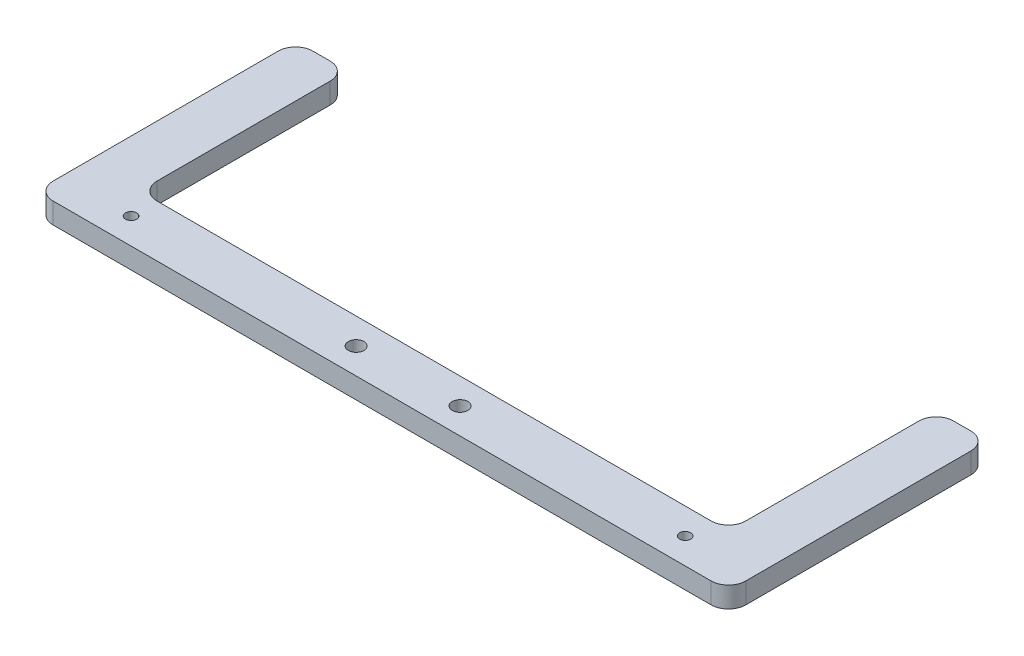
ISO-10303-21;
HEADER;
FILE_DESCRIPTION(('STEP AP214'),'2;1');
FILE_NAME('part.step','',(''),(''),'','','');
FILE_SCHEMA(('AUTOMOTIVE_DESIGN { 1 0 10303 214 1 1 1 1 }'));
ENDSEC;
DATA;
#1=APPLICATION_CONTEXT('core data for automotive mechanical design processes');
#2=APPLICATION_PROTOCOL_DEFINITION('international standard','automotive_design',2000,#1);
#3=PRODUCT_CONTEXT('',#1,'mechanical');
#4=PRODUCT('Part','Part','',(#3));
#5=PRODUCT_RELATED_PRODUCT_CATEGORY('part','',(#4));
#6=PRODUCT_DEFINITION_FORMATION('','',#4);
#7=PRODUCT_DEFINITION_CONTEXT('part definition',#1,'design');
#8=PRODUCT_DEFINITION('design','',#6,#7);
#9=PRODUCT_DEFINITION_SHAPE('','',#8);
#10=(LENGTH_UNIT() NAMED_UNIT(*) SI_UNIT(.MILLI.,.METRE.));
#11=(NAMED_UNIT(*) PLANE_ANGLE_UNIT() SI_UNIT($,.RADIAN.));
#12=(NAMED_UNIT(*) SI_UNIT($,.STERADIAN.) SOLID_ANGLE_UNIT());
#13=UNCERTAINTY_MEASURE_WITH_UNIT(LENGTH_MEASURE(1.E-05),#10,'distance_accuracy_value','');
#14=(GEOMETRIC_REPRESENTATION_CONTEXT(3) GLOBAL_UNCERTAINTY_ASSIGNED_CONTEXT((#13)) GLOBAL_UNIT_ASSIGNED_CONTEXT((#10,
#11,#12)) REPRESENTATION_CONTEXT('',''));
#15=CARTESIAN_POINT('',(0.,0.,0.));
#16=DIRECTION('',(0.,0.,1.));
#17=DIRECTION('',(1.,0.,0.));
#18=AXIS2_PLACEMENT_3D('',#15,#16,#17);
#19=CARTESIAN_POINT('',(0.,6.,0.));
#20=DIRECTION('',(0.,0.,1.));
#21=DIRECTION('',(1.,0.,0.));
#22=AXIS2_PLACEMENT_3D('',#19,#20,#21);
#23=PLANE('',#22);
#24=DIRECTION('',(-1.,0.,0.));
#25=VECTOR('',#24,1.);
#26=CARTESIAN_POINT('',(0.,6.,0.));
#27=LINE('',#26,#25);
#28=CARTESIAN_POINT('',(80.,6.,0.));
#29=VERTEX_POINT('',#28);
#30=CARTESIAN_POINT('',(-80.,6.,0.));
#31=VERTEX_POINT('',#30);
#32=EDGE_CURVE('E190',#29,#31,#27,.T.);
#33=ORIENTED_EDGE('',*,*,#32,.F.);
#34=DIRECTION('',(0.,-1.,0.));
#35=VECTOR('',#34,1.);
#36=CARTESIAN_POINT('',(80.,6.,0.));
#37=LINE('',#36,#35);
#38=CARTESIAN_POINT('',(80.,0.,0.));
#39=VERTEX_POINT('',#38);
#40=EDGE_CURVE('E218',#29,#39,#37,.T.);
#41=ORIENTED_EDGE('',*,*,#40,.T.);
#42=DIRECTION('',(-1.,0.,0.));
#43=VECTOR('',#42,1.);
#44=CARTESIAN_POINT('',(0.,0.,0.));
#45=LINE('',#44,#43);
#46=CARTESIAN_POINT('',(-80.,0.,0.));
#47=VERTEX_POINT('',#46);
#48=EDGE_CURVE('E176',#39,#47,#45,.T.);
#49=ORIENTED_EDGE('',*,*,#48,.T.);
#50=DIRECTION('',(0.,-1.,0.));
#51=VECTOR('',#50,1.);
#52=CARTESIAN_POINT('',(-80.,6.,0.));
#53=LINE('',#52,#51);
#54=EDGE_CURVE('E154',#47,#31,#53,.F.);
#55=ORIENTED_EDGE('',*,*,#54,.T.);
#56=EDGE_LOOP('',(#33,#41,#49,#55));
#57=FACE_BOUND('',#56,.T.);
#58=ADVANCED_FACE('F33',(#57),#23,.F.);
#59=CARTESIAN_POINT('',(-85.,6.,0.));
#60=DIRECTION('',(-1.,0.,0.));
#61=DIRECTION('',(0.,0.,1.));
#62=AXIS2_PLACEMENT_3D('',#59,#60,#61);
#63=PLANE('',#62);
#64=DIRECTION('',(0.,0.,-1.));
#65=VECTOR('',#64,1.);
#66=CARTESIAN_POINT('',(-85.,6.,0.));
#67=LINE('',#66,#65);
#68=CARTESIAN_POINT('',(-85.,6.,-4.99999999999999));
#69=VERTEX_POINT('',#68);
#70=CARTESIAN_POINT('',(-85.,6.,-55.));
#71=VERTEX_POINT('',#70);
#72=EDGE_CURVE('E168',#69,#71,#67,.T.);
#73=ORIENTED_EDGE('',*,*,#72,.F.);
#74=DIRECTION('',(0.,-1.,0.));
#75=VECTOR('',#74,1.);
#76=CARTESIAN_POINT('',(-85.,0.,-4.99999999999999));
#77=LINE('',#76,#75);
#78=CARTESIAN_POINT('',(-85.,0.,-4.99999999999999));
#79=VERTEX_POINT('',#78);
#80=EDGE_CURVE('E152',#69,#79,#77,.T.);
#81=ORIENTED_EDGE('',*,*,#80,.T.);
#82=DIRECTION('',(0.,0.,-1.));
#83=VECTOR('',#82,1.);
#84=CARTESIAN_POINT('',(-85.,0.,0.));
#85=LINE('',#84,#83);
#86=CARTESIAN_POINT('',(-85.,0.,-55.));
#87=VERTEX_POINT('',#86);
#88=EDGE_CURVE('E165',#79,#87,#85,.T.);
#89=ORIENTED_EDGE('',*,*,#88,.T.);
#90=DIRECTION('',(0.,-1.,0.));
#91=VECTOR('',#90,1.);
#92=CARTESIAN_POINT('',(-85.,6.,-55.));
#93=LINE('',#92,#91);
#94=EDGE_CURVE('E169',#87,#71,#93,.F.);
#95=ORIENTED_EDGE('',*,*,#94,.T.);
#96=EDGE_LOOP('',(#73,#81,#89,#95));
#97=FACE_BOUND('',#96,.T.);
#98=ADVANCED_FACE('F164',(#97),#63,.F.);
#99=CARTESIAN_POINT('',(-85.,6.,-60.));
#100=DIRECTION('',(0.,0.,1.));
#101=DIRECTION('',(1.,0.,0.));
#102=AXIS2_PLACEMENT_3D('',#99,#100,#101);
#103=PLANE('',#102);
#104=DIRECTION('',(-1.,0.,0.));
#105=VECTOR('',#104,1.);
#106=CARTESIAN_POINT('',(-85.,0.,-60.));
#107=LINE('',#106,#105);
#108=CARTESIAN_POINT('',(-90.,0.,-60.));
#109=VERTEX_POINT('',#108);
#110=CARTESIAN_POINT('',(-95.,0.,-60.));
#111=VERTEX_POINT('',#110);
#112=EDGE_CURVE('E175',#109,#111,#107,.T.);
#113=ORIENTED_EDGE('',*,*,#112,.T.);
#114=DIRECTION('',(0.,-1.,0.));
#115=VECTOR('',#114,1.);
#116=CARTESIAN_POINT('',(-95.,6.,-60.));
#117=LINE('',#116,#115);
#118=CARTESIAN_POINT('',(-95.,6.,-60.));
#119=VERTEX_POINT('',#118);
#120=EDGE_CURVE('E159',#111,#119,#117,.F.);
#121=ORIENTED_EDGE('',*,*,#120,.T.);
#122=DIRECTION('',(-1.,0.,0.));
#123=VECTOR('',#122,1.);
#124=CARTESIAN_POINT('',(-85.,6.,-60.));
#125=LINE('',#124,#123);
#126=CARTESIAN_POINT('',(-90.,6.,-60.));
#127=VERTEX_POINT('',#126);
#128=EDGE_CURVE('E269',#127,#119,#125,.T.);
#129=ORIENTED_EDGE('',*,*,#128,.F.);
#130=DIRECTION('',(0.,-1.,0.));
#131=VECTOR('',#130,1.);
#132=CARTESIAN_POINT('',(-90.,6.,-60.));
#133=LINE('',#132,#131);
#134=EDGE_CURVE('E213',#127,#109,#133,.T.);
#135=ORIENTED_EDGE('',*,*,#134,.T.);
#136=EDGE_LOOP('',(#113,#121,#129,#135));
#137=FACE_BOUND('',#136,.T.);
#138=ADVANCED_FACE('F346',(#137),#103,.F.);
#139=CARTESIAN_POINT('',(-100.,6.,-60.));
#140=DIRECTION('',(1.,0.,0.));
#141=DIRECTION('',(0.,0.,-1.));
#142=AXIS2_PLACEMENT_3D('',#139,#140,#141);
#143=PLANE('',#142);
#144=DIRECTION('',(0.,0.,1.));
#145=VECTOR('',#144,1.);
#146=CARTESIAN_POINT('',(-100.,0.,-60.));
#147=LINE('',#146,#145);
#148=CARTESIAN_POINT('',(-100.,0.,-55.));
#149=VERTEX_POINT('',#148);
#150=CARTESIAN_POINT('',(-100.,0.,10.));
#151=VERTEX_POINT('',#150);
#152=EDGE_CURVE('E179',#149,#151,#147,.T.);
#153=ORIENTED_EDGE('',*,*,#152,.T.);
#154=DIRECTION('',(0.,-1.,0.));
#155=VECTOR('',#154,1.);
#156=CARTESIAN_POINT('',(-100.,6.,10.));
#157=LINE('',#156,#155);
#158=CARTESIAN_POINT('',(-100.,6.,10.));
#159=VERTEX_POINT('',#158);
#160=EDGE_CURVE('E205',#151,#159,#157,.F.);
#161=ORIENTED_EDGE('',*,*,#160,.T.);
#162=DIRECTION('',(0.,0.,1.));
#163=VECTOR('',#162,1.);
#164=CARTESIAN_POINT('',(-100.,6.,-60.));
#165=LINE('',#164,#163);
#166=CARTESIAN_POINT('',(-100.,6.,-55.));
#167=VERTEX_POINT('',#166);
#168=EDGE_CURVE('E277',#167,#159,#165,.T.);
#169=ORIENTED_EDGE('',*,*,#168,.F.);
#170=DIRECTION('',(0.,-1.,0.));
#171=VECTOR('',#170,1.);
#172=CARTESIAN_POINT('',(-100.,6.,-55.));
#173=LINE('',#172,#171);
#174=EDGE_CURVE('E202',#167,#149,#173,.T.);
#175=ORIENTED_EDGE('',*,*,#174,.T.);
#176=EDGE_LOOP('',(#153,#161,#169,#175));
#177=FACE_BOUND('',#176,.T.);
#178=ADVANCED_FACE('F401',(#177),#143,.F.);
#179=CARTESIAN_POINT('',(-100.,6.,15.));
#180=DIRECTION('',(0.,0.,-1.));
#181=DIRECTION('',(-1.,0.,0.));
#182=AXIS2_PLACEMENT_3D('',#179,#180,#181);
#183=PLANE('',#182);
#184=DIRECTION('',(1.,0.,0.));
#185=VECTOR('',#184,1.);
#186=CARTESIAN_POINT('',(-100.,0.,15.));
#187=LINE('',#186,#185);
#188=CARTESIAN_POINT('',(-95.,0.,15.));
#189=VERTEX_POINT('',#188);
#190=CARTESIAN_POINT('',(95.,0.,15.));
#191=VERTEX_POINT('',#190);
#192=EDGE_CURVE('E187',#189,#191,#187,.T.);
#193=ORIENTED_EDGE('',*,*,#192,.T.);
#194=DIRECTION('',(0.,-1.,0.));
#195=VECTOR('',#194,1.);
#196=CARTESIAN_POINT('',(95.,6.,15.));
#197=LINE('',#196,#195);
#198=CARTESIAN_POINT('',(95.,6.,15.));
#199=VERTEX_POINT('',#198);
#200=EDGE_CURVE('E237',#191,#199,#197,.F.);
#201=ORIENTED_EDGE('',*,*,#200,.T.);
#202=DIRECTION('',(1.,0.,0.));
#203=VECTOR('',#202,1.);
#204=CARTESIAN_POINT('',(-100.,6.,15.));
#205=LINE('',#204,#203);
#206=CARTESIAN_POINT('',(-95.,6.,15.));
#207=VERTEX_POINT('',#206);
#208=EDGE_CURVE('E191',#207,#199,#205,.T.);
#209=ORIENTED_EDGE('',*,*,#208,.F.);
#210=DIRECTION('',(0.,-1.,0.));
#211=VECTOR('',#210,1.);
#212=CARTESIAN_POINT('',(-95.,6.,15.));
#213=LINE('',#212,#211);
#214=EDGE_CURVE('E194',#207,#189,#213,.T.);
#215=ORIENTED_EDGE('',*,*,#214,.T.);
#216=EDGE_LOOP('',(#193,#201,#209,#215));
#217=FACE_BOUND('',#216,.T.);
#218=ADVANCED_FACE('F395',(#217),#183,.F.);
#219=CARTESIAN_POINT('',(0.,6.,0.));
#220=DIRECTION('',(0.,1.,0.));
#221=DIRECTION('',(0.,0.,1.));
#222=AXIS2_PLACEMENT_3D('',#219,#220,#221);
#223=PLANE('',#222);
#224=CARTESIAN_POINT('',(15.,6.,7.5));
#225=DIRECTION('',(0.,-1.,0.));
#226=DIRECTION('',(0.,0.,1.));
#227=AXIS2_PLACEMENT_3D('',#224,#225,#226);
#228=CIRCLE('',#227,2.25);
#229=CARTESIAN_POINT('',(15.,6.,9.74999999999999));
#230=VERTEX_POINT('',#229);
#231=EDGE_CURVE('E300',#230,#230,#228,.T.);
#232=ORIENTED_EDGE('',*,*,#231,.T.);
#233=EDGE_LOOP('',(#232));
#234=FACE_BOUND('',#233,.T.);
#235=CARTESIAN_POINT('',(80.,6.,7.5));
#236=DIRECTION('',(0.,-1.,0.));
#237=DIRECTION('',(0.,0.,1.));
#238=AXIS2_PLACEMENT_3D('',#235,#236,#237);
#239=CIRCLE('',#238,1.60000000000001);
#240=CARTESIAN_POINT('',(80.,6.,9.1));
#241=VERTEX_POINT('',#240);
#242=EDGE_CURVE('E320',#241,#241,#239,.T.);
#243=ORIENTED_EDGE('',*,*,#242,.T.);
#244=EDGE_LOOP('',(#243));
#245=FACE_BOUND('',#244,.T.);
#246=CARTESIAN_POINT('',(-15.,6.,7.5));
#247=DIRECTION('',(0.,1.,0.));
#248=DIRECTION('',(0.,0.,1.));
#249=AXIS2_PLACEMENT_3D('',#246,#247,#248);
#250=CIRCLE('',#249,2.25);
#251=CARTESIAN_POINT('',(-15.,6.,9.74999999999999));
#252=VERTEX_POINT('',#251);
#253=EDGE_CURVE('E307',#252,#252,#250,.T.);
#254=ORIENTED_EDGE('',*,*,#253,.F.);
#255=EDGE_LOOP('',(#254));
#256=FACE_BOUND('',#255,.T.);
#257=CARTESIAN_POINT('',(-80.,6.,7.5));
#258=DIRECTION('',(0.,1.,0.));
#259=DIRECTION('',(0.,0.,1.));
#260=AXIS2_PLACEMENT_3D('',#257,#258,#259);
#261=CIRCLE('',#260,1.60000000000001);
#262=CARTESIAN_POINT('',(-80.,6.,9.1));
#263=VERTEX_POINT('',#262);
#264=EDGE_CURVE('E272',#263,#263,#261,.T.);
#265=ORIENTED_EDGE('',*,*,#264,.F.);
#266=EDGE_LOOP('',(#265));
#267=FACE_BOUND('',#266,.T.);
#268=ORIENTED_EDGE('',*,*,#208,.T.);
#269=CARTESIAN_POINT('',(95.,6.,10.));
#270=DIRECTION('',(0.,1.,0.));
#271=DIRECTION('',(0.,0.,1.));
#272=AXIS2_PLACEMENT_3D('',#269,#270,#271);
#273=CIRCLE('',#272,5.);
#274=CARTESIAN_POINT('',(100.,6.,10.));
#275=VERTEX_POINT('',#274);
#276=EDGE_CURVE('E242',#199,#275,#273,.T.);
#277=ORIENTED_EDGE('',*,*,#276,.T.);
#278=DIRECTION('',(0.,0.,1.));
#279=VECTOR('',#278,1.);
#280=CARTESIAN_POINT('',(100.,6.,-60.));
#281=LINE('',#280,#279);
#282=CARTESIAN_POINT('',(100.,6.,-55.));
#283=VERTEX_POINT('',#282);
#284=EDGE_CURVE('E258',#283,#275,#281,.T.);
#285=ORIENTED_EDGE('',*,*,#284,.F.);
#286=CARTESIAN_POINT('',(95.,6.,-55.));
#287=DIRECTION('',(0.,1.,0.));
#288=DIRECTION('',(0.,0.,1.));
#289=AXIS2_PLACEMENT_3D('',#286,#287,#288);
#290=CIRCLE('',#289,5.);
#291=CARTESIAN_POINT('',(95.,6.,-60.));
#292=VERTEX_POINT('',#291);
#293=EDGE_CURVE('E48',#283,#292,#290,.T.);
#294=ORIENTED_EDGE('',*,*,#293,.T.);
#295=DIRECTION('',(1.,0.,0.));
#296=VECTOR('',#295,1.);
#297=CARTESIAN_POINT('',(85.,6.,-60.));
#298=LINE('',#297,#296);
#299=CARTESIAN_POINT('',(90.,6.,-60.));
#300=VERTEX_POINT('',#299);
#301=EDGE_CURVE('E316',#300,#292,#298,.T.);
#302=ORIENTED_EDGE('',*,*,#301,.F.);
#303=CARTESIAN_POINT('',(90.,6.,-55.));
#304=DIRECTION('',(0.,1.,0.));
#305=DIRECTION('',(0.,0.,1.));
#306=AXIS2_PLACEMENT_3D('',#303,#304,#305);
#307=CIRCLE('',#306,5.);
#308=CARTESIAN_POINT('',(85.,6.,-55.));
#309=VERTEX_POINT('',#308);
#310=EDGE_CURVE('E239',#300,#309,#307,.T.);
#311=ORIENTED_EDGE('',*,*,#310,.T.);
#312=DIRECTION('',(0.,0.,-1.));
#313=VECTOR('',#312,1.);
#314=CARTESIAN_POINT('',(85.,6.,0.));
#315=LINE('',#314,#313);
#316=CARTESIAN_POINT('',(85.,6.,-5.00000000000001));
#317=VERTEX_POINT('',#316);
#318=EDGE_CURVE('E266',#317,#309,#315,.T.);
#319=ORIENTED_EDGE('',*,*,#318,.F.);
#320=CARTESIAN_POINT('',(80.,6.,-5.00000000000001));
#321=DIRECTION('',(0.,1.,0.));
#322=DIRECTION('',(0.,0.,1.));
#323=AXIS2_PLACEMENT_3D('',#320,#321,#322);
#324=CIRCLE('',#323,5.);
#325=EDGE_CURVE('E11',#317,#29,#324,.F.);
#326=ORIENTED_EDGE('',*,*,#325,.T.);
#327=ORIENTED_EDGE('',*,*,#32,.T.);
#328=CARTESIAN_POINT('',(-80.,6.,-4.99999999999999));
#329=DIRECTION('',(0.,1.,0.));
#330=DIRECTION('',(0.,0.,1.));
#331=AXIS2_PLACEMENT_3D('',#328,#329,#330);
#332=CIRCLE('',#331,5.);
#333=EDGE_CURVE('E158',#31,#69,#332,.F.);
#334=ORIENTED_EDGE('',*,*,#333,.T.);
#335=ORIENTED_EDGE('',*,*,#72,.T.);
#336=CARTESIAN_POINT('',(-90.,6.,-55.));
#337=DIRECTION('',(0.,1.,0.));
#338=DIRECTION('',(0.,0.,1.));
#339=AXIS2_PLACEMENT_3D('',#336,#337,#338);
#340=CIRCLE('',#339,5.);
#341=EDGE_CURVE('E207',#71,#127,#340,.T.);
#342=ORIENTED_EDGE('',*,*,#341,.T.);
#343=ORIENTED_EDGE('',*,*,#128,.T.);
#344=CARTESIAN_POINT('',(-95.,6.,-55.));
#345=DIRECTION('',(0.,1.,0.));
#346=DIRECTION('',(0.,0.,1.));
#347=AXIS2_PLACEMENT_3D('',#344,#345,#346);
#348=CIRCLE('',#347,5.);
#349=EDGE_CURVE('E209',#119,#167,#348,.T.);
#350=ORIENTED_EDGE('',*,*,#349,.T.);
#351=ORIENTED_EDGE('',*,*,#168,.T.);
#352=CARTESIAN_POINT('',(-95.,6.,10.));
#353=DIRECTION('',(0.,1.,0.));
#354=DIRECTION('',(0.,0.,1.));
#355=AXIS2_PLACEMENT_3D('',#352,#353,#354);
#356=CIRCLE('',#355,5.);
#357=EDGE_CURVE('E211',#159,#207,#356,.T.);
#358=ORIENTED_EDGE('',*,*,#357,.T.);
#359=EDGE_LOOP('',(#268,#277,#285,#294,#302,#311,#319,#326,#327,#334,#335,#342,#343,#350,#351,#358));
#360=FACE_BOUND('',#359,.T.);
#361=ADVANCED_FACE('F265',(#234,#245,#256,#267,#360),#223,.T.);
#362=CARTESIAN_POINT('',(0.,0.,0.));
#363=DIRECTION('',(0.,1.,0.));
#364=DIRECTION('',(0.,0.,1.));
#365=AXIS2_PLACEMENT_3D('',#362,#363,#364);
#366=PLANE('',#365);
#367=CARTESIAN_POINT('',(15.,0.,7.5));
#368=DIRECTION('',(0.,-1.,0.));
#369=DIRECTION('',(0.,0.,1.));
#370=AXIS2_PLACEMENT_3D('',#367,#368,#369);
#371=CIRCLE('',#370,2.25);
#372=CARTESIAN_POINT('',(15.,0.,9.74999999999999));
#373=VERTEX_POINT('',#372);
#374=EDGE_CURVE('E296',#373,#373,#371,.T.);
#375=ORIENTED_EDGE('',*,*,#374,.F.);
#376=EDGE_LOOP('',(#375));
#377=FACE_BOUND('',#376,.T.);
#378=CARTESIAN_POINT('',(80.,0.,7.5));
#379=DIRECTION('',(0.,-1.,0.));
#380=DIRECTION('',(0.,0.,1.));
#381=AXIS2_PLACEMENT_3D('',#378,#379,#380);
#382=CIRCLE('',#381,1.60000000000001);
#383=CARTESIAN_POINT('',(80.,0.,9.1));
#384=VERTEX_POINT('',#383);
#385=EDGE_CURVE('E323',#384,#384,#382,.T.);
#386=ORIENTED_EDGE('',*,*,#385,.F.);
#387=EDGE_LOOP('',(#386));
#388=FACE_BOUND('',#387,.T.);
#389=CARTESIAN_POINT('',(-15.,0.,7.5));
#390=DIRECTION('',(0.,1.,0.));
#391=DIRECTION('',(0.,0.,1.));
#392=AXIS2_PLACEMENT_3D('',#389,#390,#391);
#393=CIRCLE('',#392,2.25);
#394=CARTESIAN_POINT('',(-15.,0.,9.74999999999999));
#395=VERTEX_POINT('',#394);
#396=EDGE_CURVE('E181',#395,#395,#393,.T.);
#397=ORIENTED_EDGE('',*,*,#396,.T.);
#398=EDGE_LOOP('',(#397));
#399=FACE_BOUND('',#398,.T.);
#400=CARTESIAN_POINT('',(-80.,0.,7.5));
#401=DIRECTION('',(0.,1.,0.));
#402=DIRECTION('',(0.,0.,1.));
#403=AXIS2_PLACEMENT_3D('',#400,#401,#402);
#404=CIRCLE('',#403,1.60000000000001);
#405=CARTESIAN_POINT('',(-80.,0.,9.1));
#406=VERTEX_POINT('',#405);
#407=EDGE_CURVE('E309',#406,#406,#404,.T.);
#408=ORIENTED_EDGE('',*,*,#407,.T.);
#409=EDGE_LOOP('',(#408));
#410=FACE_BOUND('',#409,.T.);
#411=DIRECTION('',(0.,0.,1.));
#412=VECTOR('',#411,1.);
#413=CARTESIAN_POINT('',(100.,0.,-60.));
#414=LINE('',#413,#412);
#415=CARTESIAN_POINT('',(100.,0.,-55.));
#416=VERTEX_POINT('',#415);
#417=CARTESIAN_POINT('',(100.,0.,10.));
#418=VERTEX_POINT('',#417);
#419=EDGE_CURVE('E292',#416,#418,#414,.T.);
#420=ORIENTED_EDGE('',*,*,#419,.T.);
#421=CARTESIAN_POINT('',(95.,0.,10.));
#422=DIRECTION('',(0.,1.,0.));
#423=DIRECTION('',(0.,0.,1.));
#424=AXIS2_PLACEMENT_3D('',#421,#422,#423);
#425=CIRCLE('',#424,5.);
#426=EDGE_CURVE('E235',#418,#191,#425,.F.);
#427=ORIENTED_EDGE('',*,*,#426,.T.);
#428=ORIENTED_EDGE('',*,*,#192,.F.);
#429=CARTESIAN_POINT('',(-95.,0.,10.));
#430=DIRECTION('',(0.,1.,0.));
#431=DIRECTION('',(0.,0.,1.));
#432=AXIS2_PLACEMENT_3D('',#429,#430,#431);
#433=CIRCLE('',#432,5.);
#434=EDGE_CURVE('E200',#189,#151,#433,.F.);
#435=ORIENTED_EDGE('',*,*,#434,.T.);
#436=ORIENTED_EDGE('',*,*,#152,.F.);
#437=CARTESIAN_POINT('',(-95.,0.,-55.));
#438=DIRECTION('',(0.,1.,0.));
#439=DIRECTION('',(0.,0.,1.));
#440=AXIS2_PLACEMENT_3D('',#437,#438,#439);
#441=CIRCLE('',#440,5.);
#442=EDGE_CURVE('E198',#149,#111,#441,.F.);
#443=ORIENTED_EDGE('',*,*,#442,.T.);
#444=ORIENTED_EDGE('',*,*,#112,.F.);
#445=CARTESIAN_POINT('',(-90.,0.,-55.));
#446=DIRECTION('',(0.,1.,0.));
#447=DIRECTION('',(0.,0.,1.));
#448=AXIS2_PLACEMENT_3D('',#445,#446,#447);
#449=CIRCLE('',#448,5.);
#450=EDGE_CURVE('E174',#109,#87,#449,.F.);
#451=ORIENTED_EDGE('',*,*,#450,.T.);
#452=ORIENTED_EDGE('',*,*,#88,.F.);
#453=CARTESIAN_POINT('',(-80.,0.,-4.99999999999999));
#454=DIRECTION('',(0.,1.,0.));
#455=DIRECTION('',(0.,0.,1.));
#456=AXIS2_PLACEMENT_3D('',#453,#454,#455);
#457=CIRCLE('',#456,5.);
#458=EDGE_CURVE('E148',#79,#47,#457,.T.);
#459=ORIENTED_EDGE('',*,*,#458,.T.);
#460=ORIENTED_EDGE('',*,*,#48,.F.);
#461=CARTESIAN_POINT('',(80.,0.,-5.00000000000001));
#462=DIRECTION('',(0.,1.,0.));
#463=DIRECTION('',(0.,0.,1.));
#464=AXIS2_PLACEMENT_3D('',#461,#462,#463);
#465=CIRCLE('',#464,5.);
#466=CARTESIAN_POINT('',(85.,0.,-5.00000000000001));
#467=VERTEX_POINT('',#466);
#468=EDGE_CURVE('E41',#39,#467,#465,.T.);
#469=ORIENTED_EDGE('',*,*,#468,.T.);
#470=DIRECTION('',(0.,0.,-1.));
#471=VECTOR('',#470,1.);
#472=CARTESIAN_POINT('',(85.,0.,0.));
#473=LINE('',#472,#471);
#474=CARTESIAN_POINT('',(85.,0.,-55.));
#475=VERTEX_POINT('',#474);
#476=EDGE_CURVE('E249',#467,#475,#473,.T.);
#477=ORIENTED_EDGE('',*,*,#476,.T.);
#478=CARTESIAN_POINT('',(90.,0.,-55.));
#479=DIRECTION('',(0.,1.,0.));
#480=DIRECTION('',(0.,0.,1.));
#481=AXIS2_PLACEMENT_3D('',#478,#479,#480);
#482=CIRCLE('',#481,5.);
#483=CARTESIAN_POINT('',(90.,0.,-60.));
#484=VERTEX_POINT('',#483);
#485=EDGE_CURVE('E231',#475,#484,#482,.F.);
#486=ORIENTED_EDGE('',*,*,#485,.T.);
#487=DIRECTION('',(1.,0.,0.));
#488=VECTOR('',#487,1.);
#489=CARTESIAN_POINT('',(85.,0.,-60.));
#490=LINE('',#489,#488);
#491=CARTESIAN_POINT('',(95.,0.,-60.));
#492=VERTEX_POINT('',#491);
#493=EDGE_CURVE('E259',#484,#492,#490,.T.);
#494=ORIENTED_EDGE('',*,*,#493,.T.);
#495=CARTESIAN_POINT('',(95.,0.,-55.));
#496=DIRECTION('',(0.,1.,0.));
#497=DIRECTION('',(0.,0.,1.));
#498=AXIS2_PLACEMENT_3D('',#495,#496,#497);
#499=CIRCLE('',#498,5.);
#500=EDGE_CURVE('E233',#492,#416,#499,.F.);
#501=ORIENTED_EDGE('',*,*,#500,.T.);
#502=EDGE_LOOP('',(#420,#427,#428,#435,#436,#443,#444,#451,#452,#459,#460,#469,#477,#486,#494,#501));
#503=FACE_BOUND('',#502,.T.);
#504=ADVANCED_FACE('F172',(#377,#388,#399,#410,#503),#366,.F.);
#505=CARTESIAN_POINT('',(-80.,6.,-4.99999999999999));
#506=DIRECTION('',(0.,1.,0.));
#507=DIRECTION('',(0.,0.,1.));
#508=AXIS2_PLACEMENT_3D('',#505,#506,#507);
#509=CYLINDRICAL_SURFACE('',#508,5.);
#510=ORIENTED_EDGE('',*,*,#333,.F.);
#511=ORIENTED_EDGE('',*,*,#54,.F.);
#512=ORIENTED_EDGE('',*,*,#458,.F.);
#513=ORIENTED_EDGE('',*,*,#80,.F.);
#514=EDGE_LOOP('',(#510,#511,#512,#513));
#515=FACE_BOUND('',#514,.T.);
#516=ADVANCED_FACE('F151',(#515),#509,.F.);
#517=CARTESIAN_POINT('',(-95.,6.,10.));
#518=DIRECTION('',(0.,-1.,0.));
#519=DIRECTION('',(0.,0.,-1.));
#520=AXIS2_PLACEMENT_3D('',#517,#518,#519);
#521=CYLINDRICAL_SURFACE('',#520,5.);
#522=ORIENTED_EDGE('',*,*,#357,.F.);
#523=ORIENTED_EDGE('',*,*,#160,.F.);
#524=ORIENTED_EDGE('',*,*,#434,.F.);
#525=ORIENTED_EDGE('',*,*,#214,.F.);
#526=EDGE_LOOP('',(#522,#523,#524,#525));
#527=FACE_BOUND('',#526,.T.);
#528=ADVANCED_FACE('F352',(#527),#521,.T.);
#529=CARTESIAN_POINT('',(-95.,6.,-55.));
#530=DIRECTION('',(0.,-1.,0.));
#531=DIRECTION('',(0.,0.,-1.));
#532=AXIS2_PLACEMENT_3D('',#529,#530,#531);
#533=CYLINDRICAL_SURFACE('',#532,5.);
#534=ORIENTED_EDGE('',*,*,#349,.F.);
#535=ORIENTED_EDGE('',*,*,#120,.F.);
#536=ORIENTED_EDGE('',*,*,#442,.F.);
#537=ORIENTED_EDGE('',*,*,#174,.F.);
#538=EDGE_LOOP('',(#534,#535,#536,#537));
#539=FACE_BOUND('',#538,.T.);
#540=ADVANCED_FACE('F355',(#539),#533,.T.);
#541=CARTESIAN_POINT('',(-90.,6.,-55.));
#542=DIRECTION('',(0.,-1.,0.));
#543=DIRECTION('',(0.,0.,-1.));
#544=AXIS2_PLACEMENT_3D('',#541,#542,#543);
#545=CYLINDRICAL_SURFACE('',#544,5.);
#546=ORIENTED_EDGE('',*,*,#341,.F.);
#547=ORIENTED_EDGE('',*,*,#94,.F.);
#548=ORIENTED_EDGE('',*,*,#450,.F.);
#549=ORIENTED_EDGE('',*,*,#134,.F.);
#550=EDGE_LOOP('',(#546,#547,#548,#549));
#551=FACE_BOUND('',#550,.T.);
#552=ADVANCED_FACE('F359',(#551),#545,.T.);
#553=CARTESIAN_POINT('',(-80.,0.,7.5));
#554=DIRECTION('',(0.,1.,0.));
#555=DIRECTION('',(0.,0.,1.));
#556=AXIS2_PLACEMENT_3D('',#553,#554,#555);
#557=CYLINDRICAL_SURFACE('',#556,1.60000000000001);
#558=ORIENTED_EDGE('',*,*,#407,.F.);
#559=EDGE_LOOP('',(#558));
#560=FACE_BOUND('',#559,.T.);
#561=ORIENTED_EDGE('',*,*,#264,.T.);
#562=EDGE_LOOP('',(#561));
#563=FACE_BOUND('',#562,.T.);
#564=ADVANCED_FACE('F363',(#560,#563),#557,.F.);
#565=CARTESIAN_POINT('',(-15.,0.,7.5));
#566=DIRECTION('',(0.,1.,0.));
#567=DIRECTION('',(0.,0.,1.));
#568=AXIS2_PLACEMENT_3D('',#565,#566,#567);
#569=CYLINDRICAL_SURFACE('',#568,2.25);
#570=ORIENTED_EDGE('',*,*,#396,.F.);
#571=EDGE_LOOP('',(#570));
#572=FACE_BOUND('',#571,.T.);
#573=ORIENTED_EDGE('',*,*,#253,.T.);
#574=EDGE_LOOP('',(#573));
#575=FACE_BOUND('',#574,.T.);
#576=ADVANCED_FACE('F384',(#572,#575),#569,.F.);
#577=CARTESIAN_POINT('',(100.,6.,-60.));
#578=DIRECTION('',(1.,0.,0.));
#579=DIRECTION('',(0.,0.,-1.));
#580=AXIS2_PLACEMENT_3D('',#577,#578,#579);
#581=PLANE('',#580);
#582=ORIENTED_EDGE('',*,*,#284,.T.);
#583=DIRECTION('',(0.,-1.,0.));
#584=VECTOR('',#583,1.);
#585=CARTESIAN_POINT('',(100.,0.,10.));
#586=LINE('',#585,#584);
#587=EDGE_CURVE('E228',#275,#418,#586,.T.);
#588=ORIENTED_EDGE('',*,*,#587,.T.);
#589=ORIENTED_EDGE('',*,*,#419,.F.);
#590=DIRECTION('',(0.,-1.,0.));
#591=VECTOR('',#590,1.);
#592=CARTESIAN_POINT('',(100.,6.,-55.));
#593=LINE('',#592,#591);
#594=EDGE_CURVE('E226',#416,#283,#593,.F.);
#595=ORIENTED_EDGE('',*,*,#594,.T.);
#596=EDGE_LOOP('',(#582,#588,#589,#595));
#597=FACE_BOUND('',#596,.T.);
#598=ADVANCED_FACE('F291',(#597),#581,.T.);
#599=CARTESIAN_POINT('',(85.,6.,-60.));
#600=DIRECTION('',(0.,0.,-1.));
#601=DIRECTION('',(-1.,0.,0.));
#602=AXIS2_PLACEMENT_3D('',#599,#600,#601);
#603=PLANE('',#602);
#604=ORIENTED_EDGE('',*,*,#301,.T.);
#605=DIRECTION('',(0.,-1.,0.));
#606=VECTOR('',#605,1.);
#607=CARTESIAN_POINT('',(95.,6.,-60.));
#608=LINE('',#607,#606);
#609=EDGE_CURVE('E245',#292,#492,#608,.T.);
#610=ORIENTED_EDGE('',*,*,#609,.T.);
#611=ORIENTED_EDGE('',*,*,#493,.F.);
#612=DIRECTION('',(0.,-1.,0.));
#613=VECTOR('',#612,1.);
#614=CARTESIAN_POINT('',(90.,6.,-60.));
#615=LINE('',#614,#613);
#616=EDGE_CURVE('E55',#484,#300,#615,.F.);
#617=ORIENTED_EDGE('',*,*,#616,.T.);
#618=EDGE_LOOP('',(#604,#610,#611,#617));
#619=FACE_BOUND('',#618,.T.);
#620=ADVANCED_FACE('F375',(#619),#603,.T.);
#621=CARTESIAN_POINT('',(85.,6.,0.));
#622=DIRECTION('',(-1.,0.,0.));
#623=DIRECTION('',(0.,0.,1.));
#624=AXIS2_PLACEMENT_3D('',#621,#622,#623);
#625=PLANE('',#624);
#626=ORIENTED_EDGE('',*,*,#476,.F.);
#627=DIRECTION('',(0.,-1.,0.));
#628=VECTOR('',#627,1.);
#629=CARTESIAN_POINT('',(85.,6.,-5.00000000000001));
#630=LINE('',#629,#628);
#631=EDGE_CURVE('E224',#467,#317,#630,.F.);
#632=ORIENTED_EDGE('',*,*,#631,.T.);
#633=ORIENTED_EDGE('',*,*,#318,.T.);
#634=DIRECTION('',(0.,-1.,0.));
#635=VECTOR('',#634,1.);
#636=CARTESIAN_POINT('',(85.,6.,-55.));
#637=LINE('',#636,#635);
#638=EDGE_CURVE('E221',#309,#475,#637,.T.);
#639=ORIENTED_EDGE('',*,*,#638,.T.);
#640=EDGE_LOOP('',(#626,#632,#633,#639));
#641=FACE_BOUND('',#640,.T.);
#642=ADVANCED_FACE('F254',(#641),#625,.T.);
#643=CARTESIAN_POINT('',(80.,6.,-5.00000000000001));
#644=DIRECTION('',(0.,-1.,0.));
#645=DIRECTION('',(0.,0.,-1.));
#646=AXIS2_PLACEMENT_3D('',#643,#644,#645);
#647=CYLINDRICAL_SURFACE('',#646,5.);
#648=ORIENTED_EDGE('',*,*,#325,.F.);
#649=ORIENTED_EDGE('',*,*,#631,.F.);
#650=ORIENTED_EDGE('',*,*,#468,.F.);
#651=ORIENTED_EDGE('',*,*,#40,.F.);
#652=EDGE_LOOP('',(#648,#649,#650,#651));
#653=FACE_BOUND('',#652,.T.);
#654=ADVANCED_FACE('F262',(#653),#647,.F.);
#655=CARTESIAN_POINT('',(95.,6.,10.));
#656=DIRECTION('',(0.,1.,0.));
#657=DIRECTION('',(0.,0.,1.));
#658=AXIS2_PLACEMENT_3D('',#655,#656,#657);
#659=CYLINDRICAL_SURFACE('',#658,5.);
#660=ORIENTED_EDGE('',*,*,#276,.F.);
#661=ORIENTED_EDGE('',*,*,#200,.F.);
#662=ORIENTED_EDGE('',*,*,#426,.F.);
#663=ORIENTED_EDGE('',*,*,#587,.F.);
#664=EDGE_LOOP('',(#660,#661,#662,#663));
#665=FACE_BOUND('',#664,.T.);
#666=ADVANCED_FACE('F288',(#665),#659,.T.);
#667=CARTESIAN_POINT('',(95.,6.,-55.));
#668=DIRECTION('',(0.,-1.,0.));
#669=DIRECTION('',(0.,0.,-1.));
#670=AXIS2_PLACEMENT_3D('',#667,#668,#669);
#671=CYLINDRICAL_SURFACE('',#670,5.);
#672=ORIENTED_EDGE('',*,*,#293,.F.);
#673=ORIENTED_EDGE('',*,*,#594,.F.);
#674=ORIENTED_EDGE('',*,*,#500,.F.);
#675=ORIENTED_EDGE('',*,*,#609,.F.);
#676=EDGE_LOOP('',(#672,#673,#674,#675));
#677=FACE_BOUND('',#676,.T.);
#678=ADVANCED_FACE('F368',(#677),#671,.T.);
#679=CARTESIAN_POINT('',(90.,6.,-55.));
#680=DIRECTION('',(0.,-1.,0.));
#681=DIRECTION('',(0.,0.,-1.));
#682=AXIS2_PLACEMENT_3D('',#679,#680,#681);
#683=CYLINDRICAL_SURFACE('',#682,5.);
#684=ORIENTED_EDGE('',*,*,#310,.F.);
#685=ORIENTED_EDGE('',*,*,#616,.F.);
#686=ORIENTED_EDGE('',*,*,#485,.F.);
#687=ORIENTED_EDGE('',*,*,#638,.F.);
#688=EDGE_LOOP('',(#684,#685,#686,#687));
#689=FACE_BOUND('',#688,.T.);
#690=ADVANCED_FACE('F35',(#689),#683,.T.);
#691=CARTESIAN_POINT('',(80.,0.,7.5));
#692=DIRECTION('',(0.,1.,0.));
#693=DIRECTION('',(0.,0.,1.));
#694=AXIS2_PLACEMENT_3D('',#691,#692,#693);
#695=CYLINDRICAL_SURFACE('',#694,1.60000000000001);
#696=ORIENTED_EDGE('',*,*,#385,.T.);
#697=EDGE_LOOP('',(#696));
#698=FACE_BOUND('',#697,.T.);
#699=ORIENTED_EDGE('',*,*,#242,.F.);
#700=EDGE_LOOP('',(#699));
#701=FACE_BOUND('',#700,.T.);
#702=ADVANCED_FACE('F333',(#698,#701),#695,.F.);
#703=CARTESIAN_POINT('',(15.,0.,7.5));
#704=DIRECTION('',(0.,1.,0.));
#705=DIRECTION('',(0.,0.,1.));
#706=AXIS2_PLACEMENT_3D('',#703,#704,#705);
#707=CYLINDRICAL_SURFACE('',#706,2.25);
#708=ORIENTED_EDGE('',*,*,#374,.T.);
#709=EDGE_LOOP('',(#708));
#710=FACE_BOUND('',#709,.T.);
#711=ORIENTED_EDGE('',*,*,#231,.F.);
#712=EDGE_LOOP('',(#711));
#713=FACE_BOUND('',#712,.T.);
#714=ADVANCED_FACE('F331',(#710,#713),#707,.F.);
#715=CLOSED_SHELL('',(#58,#98,#138,#178,#218,#361,#504,#516,#528,#540,#552,#564,#576,#598,#620,
#642,#654,#666,#678,#690,#702,#714));
#716=MANIFOLD_SOLID_BREP('B2',#715);
#717=ADVANCED_BREP_SHAPE_REPRESENTATION('',(#18,#716),#14);
#718=SHAPE_DEFINITION_REPRESENTATION(#9,#717);
ENDSEC;
END-ISO-10303-21;
